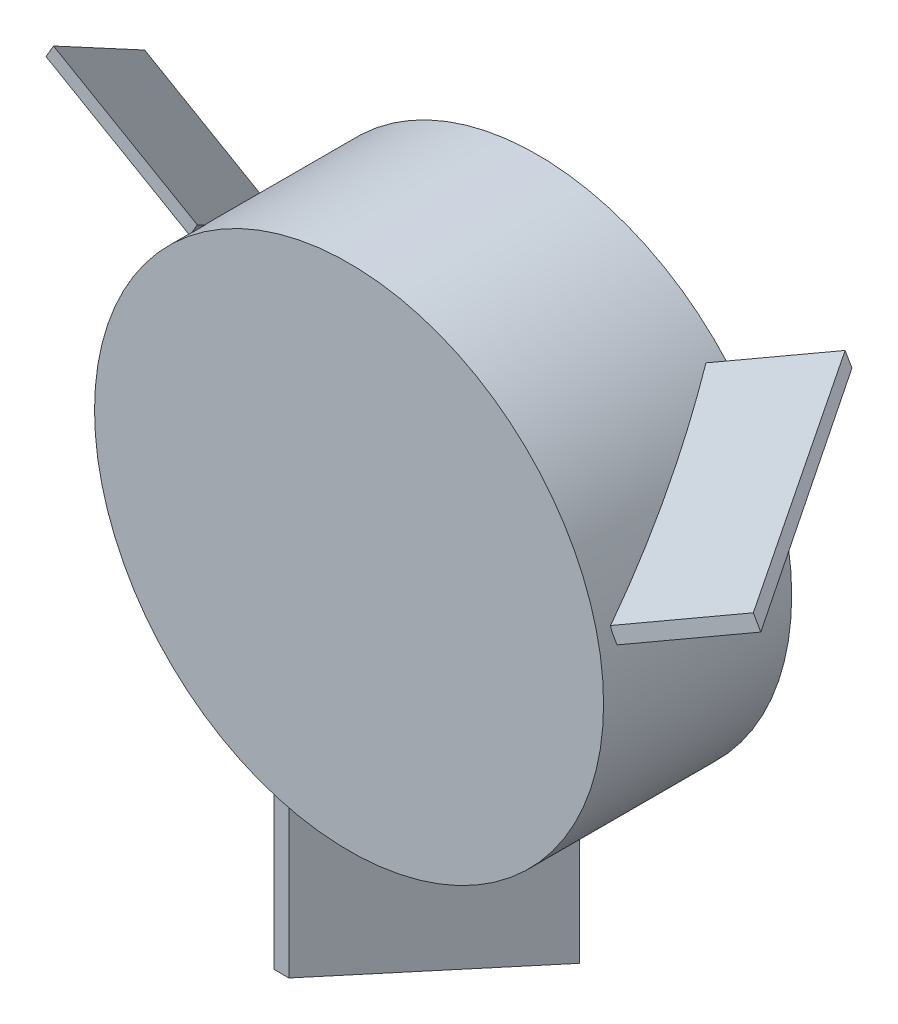
ISO-10303-21;
HEADER;
FILE_DESCRIPTION(('STEP AP214'),'2;1');
FILE_NAME('part.step','',(''),(''),'','','');
FILE_SCHEMA(('AUTOMOTIVE_DESIGN { 1 0 10303 214 1 1 1 1 }'));
ENDSEC;
DATA;
#1=APPLICATION_CONTEXT('core data for automotive mechanical design processes');
#2=APPLICATION_PROTOCOL_DEFINITION('international standard','automotive_design',2000,#1);
#3=PRODUCT_CONTEXT('',#1,'mechanical');
#4=PRODUCT('Part','Part','',(#3));
#5=PRODUCT_RELATED_PRODUCT_CATEGORY('part','',(#4));
#6=PRODUCT_DEFINITION_FORMATION('','',#4);
#7=PRODUCT_DEFINITION_CONTEXT('part definition',#1,'design');
#8=PRODUCT_DEFINITION('design','',#6,#7);
#9=PRODUCT_DEFINITION_SHAPE('','',#8);
#10=(LENGTH_UNIT() NAMED_UNIT(*) SI_UNIT(.MILLI.,.METRE.));
#11=(NAMED_UNIT(*) PLANE_ANGLE_UNIT() SI_UNIT($,.RADIAN.));
#12=(NAMED_UNIT(*) SI_UNIT($,.STERADIAN.) SOLID_ANGLE_UNIT());
#13=UNCERTAINTY_MEASURE_WITH_UNIT(LENGTH_MEASURE(1.E-05),#10,'distance_accuracy_value','');
#14=(GEOMETRIC_REPRESENTATION_CONTEXT(3) GLOBAL_UNCERTAINTY_ASSIGNED_CONTEXT((#13)) GLOBAL_UNIT_ASSIGNED_CONTEXT((#10,
#11,#12)) REPRESENTATION_CONTEXT('',''));
#15=CARTESIAN_POINT('',(0.,0.,0.));
#16=DIRECTION('',(0.,0.,1.));
#17=DIRECTION('',(1.,0.,0.));
#18=AXIS2_PLACEMENT_3D('',#15,#16,#17);
#19=CARTESIAN_POINT('',(44.41009316449,18.42959766927,-53.02834613813));
#20=DIRECTION('',(0.,0.,-1.));
#21=DIRECTION('',(-1.,0.,0.));
#22=AXIS2_PLACEMENT_3D('',#19,#20,#21);
#23=PLANE('',#22);
#24=DIRECTION('',(0.,1.,0.));
#25=VECTOR('',#24,1.);
#26=CARTESIAN_POINT('',(44.410093164485,18.42959766927,-53.0283461381258));
#27=LINE('',#26,#25);
#28=CARTESIAN_POINT('',(44.4100931644849,17.6944578085682,-53.0283461381287));
#29=VERTEX_POINT('',#28);
#30=CARTESIAN_POINT('',(44.4100931644838,3.42959766926321,-53.0283461381279));
#31=VERTEX_POINT('',#30);
#32=EDGE_CURVE('E92',#29,#31,#27,.F.);
#33=ORIENTED_EDGE('',*,*,#32,.F.);
#34=CARTESIAN_POINT('',(40.32959766927,40.32959766927,-53.02834613813));
#35=DIRECTION('',(0.,0.,-1.));
#36=DIRECTION('',(-1.,0.,0.));
#37=AXIS2_PLACEMENT_3D('',#34,#35,#36);
#38=CIRCLE('',#37,23.);
#39=CARTESIAN_POINT('',(45.64520001721,17.9522794278324,-53.0283461381304));
#40=VERTEX_POINT('',#39);
#41=EDGE_CURVE('E20',#29,#40,#38,.F.);
#42=ORIENTED_EDGE('',*,*,#41,.T.);
#43=DIRECTION('',(0.,1.,0.));
#44=VECTOR('',#43,1.);
#45=CARTESIAN_POINT('',(45.64520001721,18.42959766926,-53.02834613813));
#46=LINE('',#45,#44);
#47=CARTESIAN_POINT('',(45.6452000172096,3.42959766926585,-53.0283461381303));
#48=VERTEX_POINT('',#47);
#49=EDGE_CURVE('E89',#48,#40,#46,.T.);
#50=ORIENTED_EDGE('',*,*,#49,.F.);
#51=DIRECTION('',(1.,0.,0.));
#52=VECTOR('',#51,1.);
#53=CARTESIAN_POINT('',(40.32959766926,3.429597669264,-53.02834613813));
#54=LINE('',#53,#52);
#55=EDGE_CURVE('E94',#31,#48,#54,.T.);
#56=ORIENTED_EDGE('',*,*,#55,.F.);
#57=EDGE_LOOP('',(#33,#42,#50,#56));
#58=FACE_BOUND('',#57,.T.);
#59=ADVANCED_FACE('F17',(#58),#23,.T.);
#60=CARTESIAN_POINT('',(40.32959766926,3.429597669264,-38.5));
#61=DIRECTION('',(0.,-1.,0.));
#62=DIRECTION('',(1.,0.,0.));
#63=AXIS2_PLACEMENT_3D('',#60,#61,#62);
#64=PLANE('',#63);
#65=DIRECTION('',(1.,0.,0.));
#66=VECTOR('',#65,1.);
#67=CARTESIAN_POINT('',(33.65282943556,3.429597669268,-38.73639541373));
#68=LINE('',#67,#66);
#69=CARTESIAN_POINT('',(32.3000933587688,3.42959766926466,-38.7363954137307));
#70=VERTEX_POINT('',#69);
#71=CARTESIAN_POINT('',(33.6528294355642,3.42959766926733,-38.7363954137293));
#72=VERTEX_POINT('',#71);
#73=EDGE_CURVE('E130',#70,#72,#68,.T.);
#74=ORIENTED_EDGE('',*,*,#73,.F.);
#75=DIRECTION('',(-0.646465059235421,0.,0.762943593713024));
#76=VECTOR('',#75,1.);
#77=CARTESIAN_POINT('',(32.3000933587688,3.42959766926299,-38.736395413731));
#78=LINE('',#77,#76);
#79=EDGE_CURVE('E144',#31,#70,#78,.T.);
#80=ORIENTED_EDGE('',*,*,#79,.F.);
#81=ORIENTED_EDGE('',*,*,#55,.T.);
#82=DIRECTION('',(0.642787609686505,0.,-0.766044443119007));
#83=VECTOR('',#82,1.);
#84=CARTESIAN_POINT('',(45.6452000172094,3.429597669267,-53.0283461381305));
#85=LINE('',#84,#83);
#86=EDGE_CURVE('E101',#72,#48,#85,.T.);
#87=ORIENTED_EDGE('',*,*,#86,.F.);
#88=EDGE_LOOP('',(#74,#80,#81,#87));
#89=FACE_BOUND('',#88,.T.);
#90=ADVANCED_FACE('F512',(#89),#64,.T.);
#91=CARTESIAN_POINT('',(33.65282943556,18.42959766927,-38.73639541373));
#92=DIRECTION('',(0.,0.,1.));
#93=DIRECTION('',(1.,0.,0.));
#94=AXIS2_PLACEMENT_3D('',#91,#92,#93);
#95=PLANE('',#94);
#96=DIRECTION('',(0.,1.,0.));
#97=VECTOR('',#96,1.);
#98=CARTESIAN_POINT('',(33.6528294355619,18.42959766926,-38.7363954137284));
#99=LINE('',#98,#97);
#100=CARTESIAN_POINT('',(33.6528294355619,18.3200368841624,-38.7363954137296));
#101=VERTEX_POINT('',#100);
#102=EDGE_CURVE('E119',#101,#72,#99,.F.);
#103=ORIENTED_EDGE('',*,*,#102,.F.);
#104=CARTESIAN_POINT('',(40.32959766927,40.32959766927,-38.73639541373));
#105=DIRECTION('',(0.,0.,1.));
#106=DIRECTION('',(1.,0.,0.));
#107=AXIS2_PLACEMENT_3D('',#104,#105,#106);
#108=CIRCLE('',#107,23.);
#109=CARTESIAN_POINT('',(33.3017957369424,18.4295976692706,-38.73639541373));
#110=VERTEX_POINT('',#109);
#111=EDGE_CURVE('E106',#101,#110,#108,.F.);
#112=ORIENTED_EDGE('',*,*,#111,.T.);
#113=DIRECTION('',(1.,0.,0.));
#114=VECTOR('',#113,1.);
#115=CARTESIAN_POINT('',(33.65282943556,18.42959766927,-38.73639541373));
#116=LINE('',#115,#114);
#117=CARTESIAN_POINT('',(32.30009335877,18.4295976692705,-38.73639541373));
#118=VERTEX_POINT('',#117);
#119=EDGE_CURVE('E134',#110,#118,#116,.F.);
#120=ORIENTED_EDGE('',*,*,#119,.T.);
#121=DIRECTION('',(0.,1.,0.));
#122=VECTOR('',#121,1.);
#123=CARTESIAN_POINT('',(32.30009335877,18.42959766927,-38.73639541373));
#124=LINE('',#123,#122);
#125=EDGE_CURVE('E147',#70,#118,#124,.T.);
#126=ORIENTED_EDGE('',*,*,#125,.F.);
#127=ORIENTED_EDGE('',*,*,#73,.T.);
#128=EDGE_LOOP('',(#103,#112,#120,#126,#127));
#129=FACE_BOUND('',#128,.T.);
#130=ADVANCED_FACE('F503',(#129),#95,.T.);
#131=CARTESIAN_POINT('',(57.25530626454,54.81341042816,-53.02834613813));
#132=DIRECTION('',(0.,0.,-1.));
#133=DIRECTION('',(-1.,0.,0.));
#134=AXIS2_PLACEMENT_3D('',#131,#132,#133);
#135=PLANE('',#134);
#136=DIRECTION('',(0.866025403784479,0.499999999999931,0.));
#137=VECTOR('',#136,1.);
#138=CARTESIAN_POINT('',(57.8919560592387,55.1809803585023,-53.0283461381278));
#139=LINE('',#138,#137);
#140=CARTESIAN_POINT('',(57.8919560592432,55.180980358506,-53.0283461381289));
#141=VERTEX_POINT('',#140);
#142=CARTESIAN_POINT('',(70.2456873213096,62.3134104281539,-53.028346138128));
#143=VERTEX_POINT('',#142);
#144=EDGE_CURVE('E202',#141,#143,#139,.T.);
#145=ORIENTED_EDGE('',*,*,#144,.F.);
#146=CARTESIAN_POINT('',(40.32959766927,40.32959766927,-53.02834613813));
#147=DIRECTION('',(0.,0.,-1.));
#148=DIRECTION('',(-1.,0.,0.));
#149=AXIS2_PLACEMENT_3D('',#146,#147,#148);
#150=CIRCLE('',#149,23.);
#151=CARTESIAN_POINT('',(57.0511225609523,56.1217034597227,-53.0283461381288));
#152=VERTEX_POINT('',#151);
#153=EDGE_CURVE('E128',#141,#152,#150,.F.);
#154=ORIENTED_EDGE('',*,*,#153,.T.);
#155=DIRECTION('',(-0.866025403784552,-0.499999999999803,-1.03204153899442E-13));
#156=VECTOR('',#155,1.);
#157=CARTESIAN_POINT('',(69.6281338949486,63.3830443390023,-53.0283461381277));
#158=LINE('',#157,#156);
#159=CARTESIAN_POINT('',(69.6281338949496,63.3830443390018,-53.0283461381285));
#160=VERTEX_POINT('',#159);
#161=EDGE_CURVE('E206',#160,#152,#158,.T.);
#162=ORIENTED_EDGE('',*,*,#161,.F.);
#163=DIRECTION('',(-0.499999999999899,0.866025403784497,0.));
#164=VECTOR('',#163,1.);
#165=CARTESIAN_POINT('',(72.28593506892,58.77959766927,-53.02834613813));
#166=LINE('',#165,#164);
#167=EDGE_CURVE('E129',#143,#160,#166,.T.);
#168=ORIENTED_EDGE('',*,*,#167,.F.);
#169=EDGE_LOOP('',(#145,#154,#162,#168));
#170=FACE_BOUND('',#169,.T.);
#171=ADVANCED_FACE('F494',(#170),#135,.T.);
#172=CARTESIAN_POINT('',(72.28593506892,58.77959766927,-38.5));
#173=DIRECTION('',(0.866025403784497,0.499999999999899,0.));
#174=DIRECTION('',(-0.499999999999899,0.866025403784497,0.));
#175=AXIS2_PLACEMENT_3D('',#172,#173,#174);
#176=PLANE('',#175);
#177=DIRECTION('',(-0.500000000001441,0.866025403783607,0.));
#178=VECTOR('',#177,1.);
#179=CARTESIAN_POINT('',(76.30068722417,51.82584295658,-38.73639541373));
#180=LINE('',#179,#178);
#181=CARTESIAN_POINT('',(76.3006872241696,51.8258429565806,-38.7363954137296));
#182=VERTEX_POINT('',#181);
#183=CARTESIAN_POINT('',(75.62431918577,52.9973467636999,-38.7363954137301));
#184=VERTEX_POINT('',#183);
#185=EDGE_CURVE('E127',#182,#184,#180,.T.);
#186=ORIENTED_EDGE('',*,*,#185,.F.);
#187=DIRECTION('',(0.323232529617888,-0.55985516395676,0.762943593713042));
#188=VECTOR('',#187,1.);
#189=CARTESIAN_POINT('',(70.2456873213082,62.3134104281531,-53.0283461381269));
#190=LINE('',#189,#188);
#191=EDGE_CURVE('E205',#143,#182,#190,.T.);
#192=ORIENTED_EDGE('',*,*,#191,.F.);
#193=ORIENTED_EDGE('',*,*,#167,.T.);
#194=DIRECTION('',(-0.321393804843196,0.55667039922643,-0.766044443119001));
#195=VECTOR('',#194,1.);
#196=CARTESIAN_POINT('',(75.6243191857701,52.9973467636999,-38.7363954137301));
#197=LINE('',#196,#195);
#198=EDGE_CURVE('E211',#184,#160,#197,.T.);
#199=ORIENTED_EDGE('',*,*,#198,.F.);
#200=EDGE_LOOP('',(#186,#192,#193,#199));
#201=FACE_BOUND('',#200,.T.);
#202=ADVANCED_FACE('F348',(#201),#176,.T.);
#203=CARTESIAN_POINT('',(62.633938129,45.4973467637,-38.73639541373));
#204=DIRECTION('',(0.,0.,1.));
#205=DIRECTION('',(1.,0.,0.));
#206=AXIS2_PLACEMENT_3D('',#203,#204,#205);
#207=PLANE('',#206);
#208=DIRECTION('',(0.86602540378447,0.499999999999945,0.));
#209=VECTOR('',#208,1.);
#210=CARTESIAN_POINT('',(62.7288205521592,45.5521271562513,-38.7363954137287));
#211=LINE('',#210,#209);
#212=CARTESIAN_POINT('',(62.7288205521644,45.5521271562543,-38.7363954137304));
#213=VERTEX_POINT('',#212);
#214=EDGE_CURVE('E214',#213,#184,#211,.T.);
#215=ORIENTED_EDGE('',*,*,#214,.F.);
#216=CARTESIAN_POINT('',(40.32959766927,40.32959766927,-38.73639541373));
#217=DIRECTION('',(0.,0.,1.));
#218=DIRECTION('',(1.,0.,0.));
#219=AXIS2_PLACEMENT_3D('',#216,#217,#218);
#220=CIRCLE('',#219,23.);
#221=CARTESIAN_POINT('',(62.8094549783138,45.1933426631024,-38.73639541373));
#222=VERTEX_POINT('',#221);
#223=EDGE_CURVE('E124',#213,#222,#220,.F.);
#224=ORIENTED_EDGE('',*,*,#223,.T.);
#225=DIRECTION('',(0.500000000002236,-0.866025403783148,0.));
#226=VECTOR('',#225,1.);
#227=CARTESIAN_POINT('',(62.80945497831,45.19334266311,-38.73639541373));
#228=LINE('',#227,#226);
#229=CARTESIAN_POINT('',(63.3103061673996,44.3258429565797,-38.73639541373));
#230=VERTEX_POINT('',#229);
#231=EDGE_CURVE('E259',#222,#230,#228,.T.);
#232=ORIENTED_EDGE('',*,*,#231,.T.);
#233=DIRECTION('',(-0.866025403784472,-0.499999999999942,0.));
#234=VECTOR('',#233,1.);
#235=CARTESIAN_POINT('',(76.3006872241696,51.8258429565806,-38.7363954137294));
#236=LINE('',#235,#234);
#237=EDGE_CURVE('E199',#182,#230,#236,.T.);
#238=ORIENTED_EDGE('',*,*,#237,.F.);
#239=ORIENTED_EDGE('',*,*,#185,.T.);
#240=EDGE_LOOP('',(#215,#224,#232,#238,#239));
#241=FACE_BOUND('',#240,.T.);
#242=ADVANCED_FACE('F340',(#241),#207,.T.);
#243=CARTESIAN_POINT('',(19.32339357878,47.74578491038,-53.02834613813));
#244=DIRECTION('',(0.,0.,-1.));
#245=DIRECTION('',(-1.,0.,0.));
#246=AXIS2_PLACEMENT_3D('',#243,#244,#245);
#247=PLANE('',#246);
#248=DIRECTION('',(-0.866025403784416,0.500000000000039,0.));
#249=VECTOR('',#248,1.);
#250=CARTESIAN_POINT('',(18.6867437840812,48.1133548407321,-53.0283461381321));
#251=LINE('',#250,#249);
#252=CARTESIAN_POINT('',(18.68674378408,48.1133548407338,-53.028346138131));
#253=VERTEX_POINT('',#252);
#254=CARTESIAN_POINT('',(6.33301252201524,55.2457849103829,-53.0283461381318));
#255=VERTEX_POINT('',#254);
#256=EDGE_CURVE('E180',#253,#255,#251,.T.);
#257=ORIENTED_EDGE('',*,*,#256,.F.);
#258=CARTESIAN_POINT('',(40.32959766927,40.32959766927,-53.02834613813));
#259=DIRECTION('',(0.,0.,-1.));
#260=DIRECTION('',(-1.,0.,0.));
#261=AXIS2_PLACEMENT_3D('',#258,#259,#260);
#262=CIRCLE('',#261,23.);
#263=CARTESIAN_POINT('',(18.2924704296439,46.9148101202489,-53.0283461381278));
#264=VERTEX_POINT('',#263);
#265=EDGE_CURVE('E121',#253,#264,#262,.F.);
#266=ORIENTED_EDGE('',*,*,#265,.T.);
#267=DIRECTION('',(0.866025403784266,-0.5000000000003,-2.33164940291406E-13));
#268=VECTOR('',#267,1.);
#269=CARTESIAN_POINT('',(5.71545909564948,54.1761509995374,-53.0283461381274));
#270=LINE('',#269,#268);
#271=CARTESIAN_POINT('',(5.7154590956509,54.1761509995377,-53.0283461381283));
#272=VERTEX_POINT('',#271);
#273=EDGE_CURVE('E184',#272,#264,#270,.T.);
#274=ORIENTED_EDGE('',*,*,#273,.F.);
#275=DIRECTION('',(-0.500000000000092,-0.866025403784386,0.));
#276=VECTOR('',#275,1.);
#277=CARTESIAN_POINT('',(8.373260269624,58.77959766927,-53.02834613813));
#278=LINE('',#277,#276);
#279=EDGE_CURVE('E123',#255,#272,#278,.T.);
#280=ORIENTED_EDGE('',*,*,#279,.F.);
#281=EDGE_LOOP('',(#257,#266,#274,#280));
#282=FACE_BOUND('',#281,.T.);
#283=ADVANCED_FACE('F338',(#282),#247,.T.);
#284=CARTESIAN_POINT('',(8.373260269624,58.77959766927,-38.5));
#285=DIRECTION('',(-0.866025403784386,0.500000000000092,0.));
#286=DIRECTION('',(-0.500000000000092,-0.866025403784386,0.));
#287=AXIS2_PLACEMENT_3D('',#284,#285,#286);
#288=PLANE('',#287);
#289=DIRECTION('',(-0.50000000000144,-0.866025403783607,0.));
#290=VECTOR('',#289,1.);
#291=CARTESIAN_POINT('',(12.38801242487,65.73335238196,-38.73639541373));
#292=LINE('',#291,#290);
#293=CARTESIAN_POINT('',(12.3880124248709,65.7333523819615,-38.736395413731));
#294=VERTEX_POINT('',#293);
#295=CARTESIAN_POINT('',(11.71164438647,64.5618485748399,-38.73639541373));
#296=VERTEX_POINT('',#295);
#297=EDGE_CURVE('E120',#294,#296,#292,.T.);
#298=ORIENTED_EDGE('',*,*,#297,.F.);
#299=DIRECTION('',(0.323232529617484,0.559855163956964,0.762943593713063));
#300=VECTOR('',#299,1.);
#301=CARTESIAN_POINT('',(6.33301252201558,55.2457849103827,-53.0283461381327));
#302=LINE('',#301,#300);
#303=EDGE_CURVE('E183',#255,#294,#302,.T.);
#304=ORIENTED_EDGE('',*,*,#303,.F.);
#305=ORIENTED_EDGE('',*,*,#279,.T.);
#306=DIRECTION('',(-0.321393804843152,-0.556670399226448,-0.766044443119006));
#307=VECTOR('',#306,1.);
#308=CARTESIAN_POINT('',(11.71164438647,64.5618485748399,-38.7363954137299));
#309=LINE('',#308,#307);
#310=EDGE_CURVE('E189',#296,#272,#309,.T.);
#311=ORIENTED_EDGE('',*,*,#310,.F.);
#312=EDGE_LOOP('',(#298,#304,#305,#311));
#313=FACE_BOUND('',#312,.T.);
#314=ADVANCED_FACE('F326',(#313),#288,.T.);
#315=CARTESIAN_POINT('',(24.70202544324,57.06184857484,-38.73639541373));
#316=DIRECTION('',(0.,0.,1.));
#317=DIRECTION('',(1.,0.,0.));
#318=AXIS2_PLACEMENT_3D('',#315,#316,#317);
#319=PLANE('',#318);
#320=DIRECTION('',(-0.866025403784385,0.500000000000093,0.));
#321=VECTOR('',#320,1.);
#322=CARTESIAN_POINT('',(24.6071430200795,57.1166289673892,-38.7363954137292));
#323=LINE('',#322,#321);
#324=CARTESIAN_POINT('',(24.6071430200772,57.1166289673905,-38.7363954137302));
#325=VERTEX_POINT('',#324);
#326=EDGE_CURVE('E192',#325,#296,#323,.T.);
#327=ORIENTED_EDGE('',*,*,#326,.F.);
#328=CARTESIAN_POINT('',(40.32959766927,40.32959766927,-38.73639541373));
#329=DIRECTION('',(0.,0.,1.));
#330=DIRECTION('',(1.,0.,0.));
#331=AXIS2_PLACEMENT_3D('',#328,#329,#330);
#332=CIRCLE('',#331,23.);
#333=CARTESIAN_POINT('',(24.8775422925486,57.3658526754248,-38.73639541373));
#334=VERTEX_POINT('',#333);
#335=EDGE_CURVE('E116',#325,#334,#332,.F.);
#336=ORIENTED_EDGE('',*,*,#335,.T.);
#337=DIRECTION('',(0.50000000000223,0.866025403783151,0.));
#338=VECTOR('',#337,1.);
#339=CARTESIAN_POINT('',(24.87754229255,57.36585267543,-38.73639541373));
#340=LINE('',#339,#338);
#341=CARTESIAN_POINT('',(25.3783934816406,58.2333523819597,-38.73639541373));
#342=VERTEX_POINT('',#341);
#343=EDGE_CURVE('E234',#334,#342,#340,.T.);
#344=ORIENTED_EDGE('',*,*,#343,.T.);
#345=DIRECTION('',(0.866025403784439,-0.5,0.));
#346=VECTOR('',#345,1.);
#347=CARTESIAN_POINT('',(12.3880124248709,65.7333523819615,-38.7363954137315));
#348=LINE('',#347,#346);
#349=EDGE_CURVE('E112',#294,#342,#348,.T.);
#350=ORIENTED_EDGE('',*,*,#349,.F.);
#351=ORIENTED_EDGE('',*,*,#297,.T.);
#352=EDGE_LOOP('',(#327,#336,#344,#350,#351));
#353=FACE_BOUND('',#352,.T.);
#354=ADVANCED_FACE('F322',(#353),#319,.T.);
#355=CARTESIAN_POINT('',(45.64520001721,18.42959766926,-53.02834613813));
#356=DIRECTION('',(0.766044443119007,0.,0.642787609686505));
#357=DIRECTION('',(0.642787609686505,0.,-0.766044443119007));
#358=AXIS2_PLACEMENT_3D('',#355,#356,#357);
#359=PLANE('',#358);
#360=ORIENTED_EDGE('',*,*,#49,.T.);
#361=CARTESIAN_POINT('',(40.32959766927,40.32959766927,-46.6934579431679));
#362=DIRECTION('',(0.766044443119007,0.,0.642787609686505));
#363=DIRECTION('',(0.642787609686505,0.,-0.766044443119007));
#364=AXIS2_PLACEMENT_3D('',#361,#362,#363);
#365=ELLIPSE('',#364,35.7816480177914,23.);
#366=EDGE_CURVE('E99',#101,#40,#365,.T.);
#367=ORIENTED_EDGE('',*,*,#366,.F.);
#368=ORIENTED_EDGE('',*,*,#102,.T.);
#369=ORIENTED_EDGE('',*,*,#86,.T.);
#370=EDGE_LOOP('',(#360,#367,#368,#369));
#371=FACE_BOUND('',#370,.T.);
#372=ADVANCED_FACE('F97',(#371),#359,.T.);
#373=CARTESIAN_POINT('',(32.30009335877,18.42959766927,-38.73639541373));
#374=DIRECTION('',(-0.762943593713024,1.05138120432003E-13,-0.646465059235421));
#375=DIRECTION('',(-0.646465059235421,0.,0.762943593713024));
#376=AXIS2_PLACEMENT_3D('',#373,#374,#375);
#377=PLANE('',#376);
#378=DIRECTION('',(0.646465059232026,0.,-0.762943593715901));
#379=VECTOR('',#378,1.);
#380=CARTESIAN_POINT('',(32.30009335877,18.4295976692707,-38.73639541373));
#381=LINE('',#380,#379);
#382=CARTESIAN_POINT('',(33.3017957369404,18.4295976692711,-39.9185821403251));
#383=VERTEX_POINT('',#382);
#384=EDGE_CURVE('E217',#118,#383,#381,.T.);
#385=ORIENTED_EDGE('',*,*,#384,.T.);
#386=CARTESIAN_POINT('',(40.32959766927,40.32959766927,-48.2126366844185));
#387=DIRECTION('',(-0.762943593713024,1.05138120432003E-13,-0.646465059235421));
#388=DIRECTION('',(0.646465059235421,0.,-0.762943593713024));
#389=AXIS2_PLACEMENT_3D('',#386,#387,#388);
#390=ELLIPSE('',#389,35.5781022832112,23.);
#391=EDGE_CURVE('E108',#29,#383,#390,.T.);
#392=ORIENTED_EDGE('',*,*,#391,.F.);
#393=ORIENTED_EDGE('',*,*,#32,.T.);
#394=ORIENTED_EDGE('',*,*,#79,.T.);
#395=ORIENTED_EDGE('',*,*,#125,.T.);
#396=EDGE_LOOP('',(#385,#392,#393,#394,#395));
#397=FACE_BOUND('',#396,.T.);
#398=ADVANCED_FACE('F286',(#397),#377,.T.);
#399=CARTESIAN_POINT('',(40.32959766926,18.42959766927,-38.5));
#400=DIRECTION('',(0.,-1.,0.));
#401=DIRECTION('',(1.,0.,0.));
#402=AXIS2_PLACEMENT_3D('',#399,#400,#401);
#403=PLANE('',#402);
#404=ORIENTED_EDGE('',*,*,#119,.F.);
#405=DIRECTION('',(0.,0.,-1.));
#406=VECTOR('',#405,1.);
#407=CARTESIAN_POINT('',(33.3017957369404,18.4295976692713,-54.5));
#408=LINE('',#407,#406);
#409=EDGE_CURVE('E110',#383,#110,#408,.F.);
#410=ORIENTED_EDGE('',*,*,#409,.F.);
#411=ORIENTED_EDGE('',*,*,#384,.F.);
#412=EDGE_LOOP('',(#404,#410,#411));
#413=FACE_BOUND('',#412,.T.);
#414=ADVANCED_FACE('F292',(#413),#403,.F.);
#415=CARTESIAN_POINT('',(56.63775283817,55.883044339,-53.02834613813));
#416=DIRECTION('',(-0.383022221559407,0.663413948169012,0.642787609686512));
#417=DIRECTION('',(0.,-0.695854045534142,0.718183226839619));
#418=AXIS2_PLACEMENT_3D('',#415,#416,#417);
#419=PLANE('',#418);
#420=ORIENTED_EDGE('',*,*,#161,.T.);
#421=CARTESIAN_POINT('',(40.32959766927,40.32959766927,-46.693457943163));
#422=DIRECTION('',(-0.383022221559407,0.663413948169012,0.642787609686512));
#423=DIRECTION('',(-0.321393804843178,0.556670399226441,-0.766044443119001));
#424=AXIS2_PLACEMENT_3D('',#421,#422,#423);
#425=ELLIPSE('',#424,35.781648017791,23.);
#426=EDGE_CURVE('E169',#213,#152,#425,.T.);
#427=ORIENTED_EDGE('',*,*,#426,.F.);
#428=ORIENTED_EDGE('',*,*,#214,.T.);
#429=ORIENTED_EDGE('',*,*,#198,.T.);
#430=EDGE_LOOP('',(#420,#427,#428,#429));
#431=FACE_BOUND('',#430,.T.);
#432=ADVANCED_FACE('F378',(#431),#419,.T.);
#433=CARTESIAN_POINT('',(63.3103061674,44.32584295658,-38.73639541373));
#434=DIRECTION('',(0.3814717968565,-0.6607285338101,-0.6464650592354));
#435=DIRECTION('',(0.,0.699349536889776,-0.71477984390444));
#436=AXIS2_PLACEMENT_3D('',#433,#434,#435);
#437=PLANE('',#436);
#438=DIRECTION('',(-0.32323252961695,0.55985516395572,-0.762943593714202));
#439=VECTOR('',#438,1.);
#440=CARTESIAN_POINT('',(63.3103061673993,44.3258429565796,-38.73639541373));
#441=LINE('',#440,#439);
#442=CARTESIAN_POINT('',(62.8094549783137,45.1933426631046,-39.9185821403204));
#443=VERTEX_POINT('',#442);
#444=EDGE_CURVE('E195',#230,#443,#441,.T.);
#445=ORIENTED_EDGE('',*,*,#444,.T.);
#446=CARTESIAN_POINT('',(40.32959766927,40.32959766927,-48.2126366844226));
#447=DIRECTION('',(0.3814717968565,-0.6607285338101,-0.6464650592354));
#448=DIRECTION('',(-0.323232529617682,0.559855163956879,-0.762943593713042));
#449=AXIS2_PLACEMENT_3D('',#446,#447,#448);
#450=ELLIPSE('',#449,35.5781022832124,23.);
#451=EDGE_CURVE('E167',#141,#443,#450,.T.);
#452=ORIENTED_EDGE('',*,*,#451,.F.);
#453=ORIENTED_EDGE('',*,*,#144,.T.);
#454=ORIENTED_EDGE('',*,*,#191,.T.);
#455=ORIENTED_EDGE('',*,*,#237,.T.);
#456=EDGE_LOOP('',(#445,#452,#453,#454,#455));
#457=FACE_BOUND('',#456,.T.);
#458=ADVANCED_FACE('F374',(#457),#437,.T.);
#459=CARTESIAN_POINT('',(59.29555401215,51.27959766927,-38.5));
#460=DIRECTION('',(0.866025403784497,0.499999999999899,0.));
#461=DIRECTION('',(-0.499999999999899,0.866025403784497,0.));
#462=AXIS2_PLACEMENT_3D('',#459,#460,#461);
#463=PLANE('',#462);
#464=ORIENTED_EDGE('',*,*,#231,.F.);
#465=DIRECTION('',(0.,0.,-1.));
#466=VECTOR('',#465,1.);
#467=CARTESIAN_POINT('',(62.8094549783141,45.1933426631009,-54.5));
#468=LINE('',#467,#466);
#469=EDGE_CURVE('E166',#443,#222,#468,.F.);
#470=ORIENTED_EDGE('',*,*,#469,.F.);
#471=ORIENTED_EDGE('',*,*,#444,.F.);
#472=EDGE_LOOP('',(#464,#470,#471));
#473=FACE_BOUND('',#472,.T.);
#474=ADVANCED_FACE('F370',(#473),#463,.F.);
#475=CARTESIAN_POINT('',(40.32959766927,40.32959766927,-37.5));
#476=DIRECTION('',(0.,0.,-1.));
#477=DIRECTION('',(-1.,0.,0.));
#478=AXIS2_PLACEMENT_3D('',#475,#476,#477);
#479=PLANE('',#478);
#480=CARTESIAN_POINT('',(40.32959766927,40.32959766927,-37.5));
#481=DIRECTION('',(0.,0.,-1.));
#482=DIRECTION('',(-1.,0.,0.));
#483=AXIS2_PLACEMENT_3D('',#480,#481,#482);
#484=CIRCLE('',#483,23.);
#485=CARTESIAN_POINT('',(17.32959766927,40.32959766927,-37.5));
#486=VERTEX_POINT('',#485);
#487=EDGE_CURVE('E163',#486,#486,#484,.T.);
#488=ORIENTED_EDGE('',*,*,#487,.F.);
#489=EDGE_LOOP('',(#488));
#490=FACE_BOUND('',#489,.T.);
#491=ADVANCED_FACE('F367',(#490),#479,.F.);
#492=CARTESIAN_POINT('',(18.70584015242,46.67615099953,-53.02834613813));
#493=DIRECTION('',(-0.383022221559603,-0.663413948168905,0.642787609686505));
#494=DIRECTION('',(0.,-0.695854045534196,-0.718183226839567));
#495=AXIS2_PLACEMENT_3D('',#492,#493,#494);
#496=PLANE('',#495);
#497=ORIENTED_EDGE('',*,*,#273,.T.);
#498=CARTESIAN_POINT('',(40.32959766927,40.32959766927,-46.6934579431573));
#499=DIRECTION('',(-0.383022221559603,-0.663413948168905,0.642787609686505));
#500=DIRECTION('',(-0.321393804843336,-0.556670399226342,-0.766044443119007));
#501=AXIS2_PLACEMENT_3D('',#498,#499,#500);
#502=ELLIPSE('',#501,35.7816480177914,23.);
#503=EDGE_CURVE('E160',#325,#264,#502,.T.);
#504=ORIENTED_EDGE('',*,*,#503,.F.);
#505=ORIENTED_EDGE('',*,*,#326,.T.);
#506=ORIENTED_EDGE('',*,*,#310,.T.);
#507=EDGE_LOOP('',(#497,#504,#505,#506));
#508=FACE_BOUND('',#507,.T.);
#509=ADVANCED_FACE('F329',(#508),#496,.T.);
#510=CARTESIAN_POINT('',(25.37839348164,58.23335238196,-38.73639541373));
#511=DIRECTION('',(0.381471796856585,0.660728533810075,-0.646465059235375));
#512=DIRECTION('',(0.,0.699349536889776,0.71477984390444));
#513=AXIS2_PLACEMENT_3D('',#510,#511,#512);
#514=PLANE('',#513);
#515=DIRECTION('',(-0.323232529618702,-0.559855163958469,-0.762943593711442));
#516=VECTOR('',#515,1.);
#517=CARTESIAN_POINT('',(25.3783934816409,58.2333523819595,-38.73639541373));
#518=LINE('',#517,#516);
#519=CARTESIAN_POINT('',(24.8775422925521,57.3658526754278,-39.918582140324));
#520=VERTEX_POINT('',#519);
#521=EDGE_CURVE('E35',#342,#520,#518,.T.);
#522=ORIENTED_EDGE('',*,*,#521,.T.);
#523=CARTESIAN_POINT('',(40.32959766927,40.32959766927,-48.212636684421));
#524=DIRECTION('',(0.381471796856585,0.660728533810075,-0.646465059235375));
#525=DIRECTION('',(-0.323232529617733,-0.55985516395682,-0.762943593713063));
#526=AXIS2_PLACEMENT_3D('',#523,#524,#525);
#527=ELLIPSE('',#526,35.5781022832137,23.);
#528=EDGE_CURVE('E157',#253,#520,#527,.T.);
#529=ORIENTED_EDGE('',*,*,#528,.F.);
#530=ORIENTED_EDGE('',*,*,#256,.T.);
#531=ORIENTED_EDGE('',*,*,#303,.T.);
#532=ORIENTED_EDGE('',*,*,#349,.T.);
#533=EDGE_LOOP('',(#522,#529,#530,#531,#532));
#534=FACE_BOUND('',#533,.T.);
#535=ADVANCED_FACE('F335',(#534),#514,.T.);
#536=CARTESIAN_POINT('',(21.36364132639,51.27959766927,-38.5));
#537=DIRECTION('',(-0.866025403784386,0.500000000000092,0.));
#538=DIRECTION('',(-0.500000000000092,-0.866025403784386,0.));
#539=AXIS2_PLACEMENT_3D('',#536,#537,#538);
#540=PLANE('',#539);
#541=ORIENTED_EDGE('',*,*,#343,.F.);
#542=DIRECTION('',(0.,0.,-1.));
#543=VECTOR('',#542,1.);
#544=CARTESIAN_POINT('',(24.8775422925519,57.3658526754279,-54.5));
#545=LINE('',#544,#543);
#546=EDGE_CURVE('E26',#520,#334,#545,.F.);
#547=ORIENTED_EDGE('',*,*,#546,.F.);
#548=ORIENTED_EDGE('',*,*,#521,.F.);
#549=EDGE_LOOP('',(#541,#547,#548));
#550=FACE_BOUND('',#549,.T.);
#551=ADVANCED_FACE('F336',(#550),#540,.F.);
#552=CARTESIAN_POINT('',(40.32959766927,40.32959766927,-54.5));
#553=DIRECTION('',(0.,0.,-1.));
#554=DIRECTION('',(-1.,0.,0.));
#555=AXIS2_PLACEMENT_3D('',#552,#553,#554);
#556=CYLINDRICAL_SURFACE('',#555,23.);
#557=ORIENTED_EDGE('',*,*,#487,.T.);
#558=EDGE_LOOP('',(#557));
#559=FACE_BOUND('',#558,.T.);
#560=ORIENTED_EDGE('',*,*,#528,.T.);
#561=ORIENTED_EDGE('',*,*,#546,.T.);
#562=ORIENTED_EDGE('',*,*,#335,.F.);
#563=ORIENTED_EDGE('',*,*,#503,.T.);
#564=ORIENTED_EDGE('',*,*,#265,.F.);
#565=EDGE_LOOP('',(#560,#561,#562,#563,#564));
#566=FACE_BOUND('',#565,.T.);
#567=CARTESIAN_POINT('',(40.32959766927,40.32959766927,-54.5));
#568=DIRECTION('',(0.,0.,-1.));
#569=DIRECTION('',(-1.,0.,0.));
#570=AXIS2_PLACEMENT_3D('',#567,#568,#569);
#571=CIRCLE('',#570,23.);
#572=CARTESIAN_POINT('',(17.32959766927,40.32959766927,-54.5));
#573=VERTEX_POINT('',#572);
#574=EDGE_CURVE('E11',#573,#573,#571,.T.);
#575=ORIENTED_EDGE('',*,*,#574,.F.);
#576=EDGE_LOOP('',(#575));
#577=FACE_BOUND('',#576,.T.);
#578=ORIENTED_EDGE('',*,*,#451,.T.);
#579=ORIENTED_EDGE('',*,*,#469,.T.);
#580=ORIENTED_EDGE('',*,*,#223,.F.);
#581=ORIENTED_EDGE('',*,*,#426,.T.);
#582=ORIENTED_EDGE('',*,*,#153,.F.);
#583=EDGE_LOOP('',(#578,#579,#580,#581,#582));
#584=FACE_BOUND('',#583,.T.);
#585=ORIENTED_EDGE('',*,*,#391,.T.);
#586=ORIENTED_EDGE('',*,*,#409,.T.);
#587=ORIENTED_EDGE('',*,*,#111,.F.);
#588=ORIENTED_EDGE('',*,*,#366,.T.);
#589=ORIENTED_EDGE('',*,*,#41,.F.);
#590=EDGE_LOOP('',(#585,#586,#587,#588,#589));
#591=FACE_BOUND('',#590,.T.);
#592=ADVANCED_FACE('F103',(#559,#566,#577,#584,#591),#556,.T.);
#593=CARTESIAN_POINT('',(40.32959766927,40.32959766927,-54.5));
#594=DIRECTION('',(0.,0.,-1.));
#595=DIRECTION('',(-1.,0.,0.));
#596=AXIS2_PLACEMENT_3D('',#593,#594,#595);
#597=PLANE('',#596);
#598=ORIENTED_EDGE('',*,*,#574,.T.);
#599=EDGE_LOOP('',(#598));
#600=FACE_BOUND('',#599,.T.);
#601=ADVANCED_FACE('F351',(#600),#597,.T.);
#602=CLOSED_SHELL('',(#59,#90,#130,#171,#202,#242,#283,#314,#354,#372,#398,#414,#432,#458,#474,
#491,#509,#535,#551,#592,#601));
#603=MANIFOLD_SOLID_BREP('B1',#602);
#604=ADVANCED_BREP_SHAPE_REPRESENTATION('',(#18,#603),#14);
#605=SHAPE_DEFINITION_REPRESENTATION(#9,#604);
ENDSEC;
END-ISO-10303-21;
